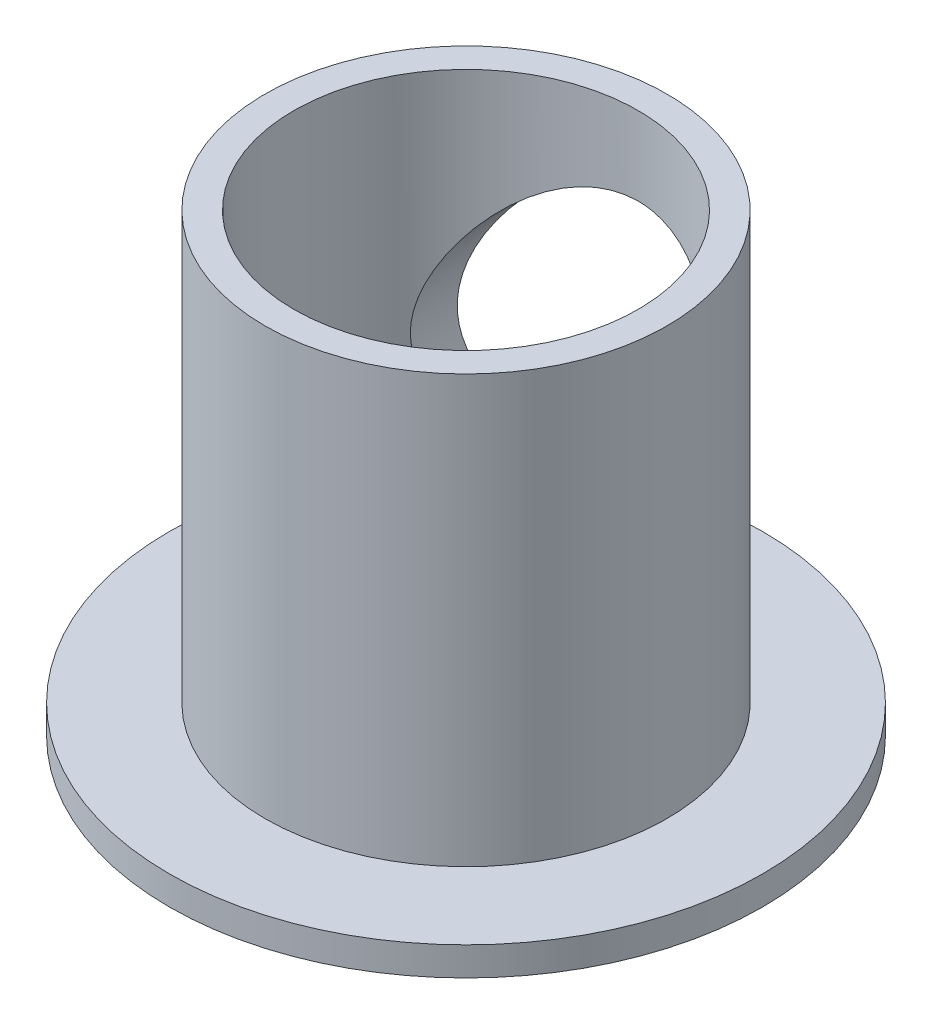
ISO-10303-21;
HEADER;
FILE_DESCRIPTION(('STEP AP214'),'2;1');
FILE_NAME('part.step','',(''),(''),'','','');
FILE_SCHEMA(('AUTOMOTIVE_DESIGN { 1 0 10303 214 1 1 1 1 }'));
ENDSEC;
DATA;
#1=APPLICATION_CONTEXT('core data for automotive mechanical design processes');
#2=APPLICATION_PROTOCOL_DEFINITION('international standard','automotive_design',2000,#1);
#3=PRODUCT_CONTEXT('',#1,'mechanical');
#4=PRODUCT('Part','Part','',(#3));
#5=PRODUCT_RELATED_PRODUCT_CATEGORY('part','',(#4));
#6=PRODUCT_DEFINITION_FORMATION('','',#4);
#7=PRODUCT_DEFINITION_CONTEXT('part definition',#1,'design');
#8=PRODUCT_DEFINITION('design','',#6,#7);
#9=PRODUCT_DEFINITION_SHAPE('','',#8);
#10=(LENGTH_UNIT() NAMED_UNIT(*) SI_UNIT(.MILLI.,.METRE.));
#11=(NAMED_UNIT(*) PLANE_ANGLE_UNIT() SI_UNIT($,.RADIAN.));
#12=(NAMED_UNIT(*) SI_UNIT($,.STERADIAN.) SOLID_ANGLE_UNIT());
#13=UNCERTAINTY_MEASURE_WITH_UNIT(LENGTH_MEASURE(1.E-05),#10,'distance_accuracy_value','');
#14=(GEOMETRIC_REPRESENTATION_CONTEXT(3) GLOBAL_UNCERTAINTY_ASSIGNED_CONTEXT((#13)) GLOBAL_UNIT_ASSIGNED_CONTEXT((#10,
#11,#12)) REPRESENTATION_CONTEXT('',''));
#15=CARTESIAN_POINT('',(0.,0.,0.));
#16=DIRECTION('',(0.,0.,1.));
#17=DIRECTION('',(1.,0.,0.));
#18=AXIS2_PLACEMENT_3D('',#15,#16,#17);
#19=CARTESIAN_POINT('',(0.,38.3,0.));
#20=DIRECTION('',(0.,-1.,0.));
#21=DIRECTION('',(0.,0.,-1.));
#22=AXIS2_PLACEMENT_3D('',#19,#20,#21);
#23=CYLINDRICAL_SURFACE('',#22,10.5);
#24=CARTESIAN_POINT('',(0.,0.,0.));
#25=DIRECTION('',(0.,1.,0.));
#26=DIRECTION('',(0.,0.,1.));
#27=AXIS2_PLACEMENT_3D('',#24,#25,#26);
#28=CIRCLE('',#27,10.5);
#29=CARTESIAN_POINT('',(0.,0.,10.5));
#30=VERTEX_POINT('',#29);
#31=EDGE_CURVE('E10',#30,#30,#28,.T.);
#32=ORIENTED_EDGE('',*,*,#31,.T.);
#33=EDGE_LOOP('',(#32));
#34=FACE_BOUND('',#33,.T.);
#35=CARTESIAN_POINT('',(0.,18.2,-10.5));
#36=CARTESIAN_POINT('',(-0.18813396926989,18.1999981399652,-10.4999982143638));
#37=CARTESIAN_POINT('',(-0.37632023168205,18.1930472478068,-10.494931071505));
#38=CARTESIAN_POINT('',(-0.751217544132532,18.1653490834224,-10.4747770476934));
#39=CARTESIAN_POINT('',(-0.93792761183307,18.1445932975088,-10.4596839836098));
#40=CARTESIAN_POINT('',(-1.30867183138487,18.0895664432479,-10.4197985544311));
#41=CARTESIAN_POINT('',(-1.49269999850735,18.0552688753554,-10.3949871725866));
#42=CARTESIAN_POINT('',(-1.85643183581326,17.9736733501462,-10.3362288065562));
#43=CARTESIAN_POINT('',(-2.03613354441446,17.9263696123128,-10.3022777604401));
#44=CARTESIAN_POINT('',(-2.38884760730317,17.8197747030476,-10.2262278665124));
#45=CARTESIAN_POINT('',(-2.56189565818614,17.7605628943339,-10.1841830361428));
#46=CARTESIAN_POINT('',(-2.90163513474682,17.6306872716277,-10.0926468767225));
#47=CARTESIAN_POINT('',(-3.06832402227701,17.5600189428385,-10.0431526125444));
#48=CARTESIAN_POINT('',(-3.55741728882151,17.3320677308045,-9.88493262830776));
#49=CARTESIAN_POINT('',(-3.86931659038185,17.1586945091357,-9.76636500186583));
#50=CARTESIAN_POINT('',(-4.48760223352023,16.7574278433571,-9.49922125826219));
#51=CARTESIAN_POINT('',(-4.79090179549309,16.5260079288354,-9.34889592100059));
#52=CARTESIAN_POINT('',(-5.35720552875823,16.0241413328602,-9.03631328380783));
#53=CARTESIAN_POINT('',(-5.62014479892603,15.7536331238741,-8.87403737413817));
#54=CARTESIAN_POINT('',(-6.00567504746141,15.2938981501326,-8.61464430894793));
#55=CARTESIAN_POINT('',(-6.14206918453724,15.1159500069083,-8.51767225553696));
#56=CARTESIAN_POINT('',(-6.39933226270985,14.7477963236592,-8.3261173931474));
#57=CARTESIAN_POINT('',(-6.52019677668207,14.5575873114575,-8.23153527162722));
#58=CARTESIAN_POINT('',(-6.74552753651135,14.1654408645094,-8.04791676019386));
#59=CARTESIAN_POINT('',(-6.8500124826915,13.963517170629,-7.95887411706089));
#60=CARTESIAN_POINT('',(-7.04170529057769,13.5482046926106,-7.78978224863079));
#61=CARTESIAN_POINT('',(-7.12892275827684,13.3348223674427,-7.70972803381294));
#62=CARTESIAN_POINT('',(-7.31125384149064,12.8225829701512,-7.53765367493881));
#63=CARTESIAN_POINT('',(-7.39905925729172,12.5192280829539,-7.45074551299657));
#64=CARTESIAN_POINT('',(-7.50265593878444,12.0526863884303,-7.34592068809347));
#65=CARTESIAN_POINT('',(-7.53249458883303,11.8953402474772,-7.31524477142138));
#66=CARTESIAN_POINT('',(-7.58237567206683,11.5775687348941,-7.26353079491979));
#67=CARTESIAN_POINT('',(-7.60242298245825,11.4171449377613,-7.24248793705429));
#68=CARTESIAN_POINT('',(-7.63244969817804,11.0930522322078,-7.21083882593878));
#69=CARTESIAN_POINT('',(-7.64234934859619,10.9293677717043,-7.20031526423087));
#70=CARTESIAN_POINT('',(-7.65158638369177,10.6013639511191,-7.19049881455281));
#71=CARTESIAN_POINT('',(-7.6509241611486,10.4370446148746,-7.19120550894715));
#72=CARTESIAN_POINT('',(-7.63904868963788,10.1091230680915,-7.20381898632499));
#73=CARTESIAN_POINT('',(-7.62782884953874,9.94552136968114,-7.21573276590194));
#74=CARTESIAN_POINT('',(-7.59507754339413,9.62049005326289,-7.25019689537212));
#75=CARTESIAN_POINT('',(-7.5735449244802,9.45906068017463,-7.27274843445925));
#76=CARTESIAN_POINT('',(-7.51758263391757,9.12137458051139,-7.33060348325488));
#77=CARTESIAN_POINT('',(-7.48196684382898,8.94551368291596,-7.36706353309181));
#78=CARTESIAN_POINT('',(-7.39916408141991,8.59893538583553,-7.4502217241013));
#79=CARTESIAN_POINT('',(-7.35196934932312,8.42822152220906,-7.49692672882889));
#80=CARTESIAN_POINT('',(-7.24665154923289,8.09244796092917,-7.5987768934508));
#81=CARTESIAN_POINT('',(-7.18850847844725,7.92739927671452,-7.65393746695728));
#82=CARTESIAN_POINT('',(-7.06202946602937,7.6037437227824,-7.77078840738445));
#83=CARTESIAN_POINT('',(-6.99369633380648,7.44513509282237,-7.8324769731747));
#84=CARTESIAN_POINT('',(-6.82249035233985,7.08170792325707,-7.98251801055776));
#85=CARTESIAN_POINT('',(-6.71576992241137,6.87949565056934,-8.07280935446103));
#86=CARTESIAN_POINT('',(-6.48592972635248,6.4871269243779,-8.25860596710564));
#87=CARTESIAN_POINT('',(-6.36280481560688,6.29697428062477,-8.35411286593137));
#88=CARTESIAN_POINT('',(-6.10070585253969,5.92885523117093,-8.54739303889987));
#89=CARTESIAN_POINT('',(-5.96171750591403,5.75090005119443,-8.64516829281177));
#90=CARTESIAN_POINT('',(-5.66845389629616,5.40781667363975,-8.84022884761121));
#91=CARTESIAN_POINT('',(-5.51418033227573,5.24268705411552,-8.93751420169143));
#92=CARTESIAN_POINT('',(-5.18859094840874,4.92384618568326,-9.13043235853823));
#93=CARTESIAN_POINT('',(-5.0170798850278,4.77031100100795,-9.2260273118198));
#94=CARTESIAN_POINT('',(-4.65911124736444,4.47805091948602,-9.41187292319723));
#95=CARTESIAN_POINT('',(-4.47265210490244,4.33932758009607,-9.50212301884105));
#96=CARTESIAN_POINT('',(-4.08576113617971,4.07826085762536,-9.67477879002408));
#97=CARTESIAN_POINT('',(-3.88535720165399,3.95588613010096,-9.75719938637782));
#98=CARTESIAN_POINT('',(-3.47117976005621,3.72877324928194,-9.91210065116896));
#99=CARTESIAN_POINT('',(-3.25741132385175,3.6240284617246,-9.98458505674654));
#100=CARTESIAN_POINT('',(-2.87421920951223,3.45823772722763,-10.1003981364266));
#101=CARTESIAN_POINT('',(-2.70746998481837,3.39287205748762,-10.1464382366331));
#102=CARTESIAN_POINT('',(-2.36809683891222,3.2735344389724,-10.2309664417583));
#103=CARTESIAN_POINT('',(-2.195474217944,3.21955998723873,-10.2694562055586));
#104=CARTESIAN_POINT('',(-1.84537583092436,3.12369474490672,-10.3381038369576));
#105=CARTESIAN_POINT('',(-1.66790265051404,3.0817976487702,-10.368266051987));
#106=CARTESIAN_POINT('',(-1.30915092884654,3.01063252845523,-10.4196427409978));
#107=CARTESIAN_POINT('',(-1.12787228769624,2.98136483623367,-10.4408569797862));
#108=CARTESIAN_POINT('',(-0.762139828546284,2.93582071263672,-10.4739190087213));
#109=CARTESIAN_POINT('',(-0.577676647248945,2.91959345093864,-10.4857313468897));
#110=CARTESIAN_POINT('',(-0.20769002934746,2.90057673380158,-10.4995777807668));
#111=CARTESIAN_POINT('',(-0.0221665945380221,2.89778725562299,-10.5016118930223));
#112=CARTESIAN_POINT('',(0.34844469032207,2.90569213984369,-10.495853254121));
#113=CARTESIAN_POINT('',(0.533532523611192,2.91638701287618,-10.4880601308207));
#114=CARTESIAN_POINT('',(0.90178425556191,2.95108641588602,-10.4628316340537));
#115=CARTESIAN_POINT('',(1.08494820583934,2.97509058785421,-10.4453965199487));
#116=CARTESIAN_POINT('',(1.43751983367347,3.03427436266542,-10.4025593627168));
#117=CARTESIAN_POINT('',(1.60711271069616,3.06873163250217,-10.3776733361537));
#118=CARTESIAN_POINT('',(1.94239027010075,3.14869370464981,-10.3201774845422));
#119=CARTESIAN_POINT('',(2.10807360229379,3.19420226406406,-10.2875650328358));
#120=CARTESIAN_POINT('',(2.43454851069882,3.29571271407372,-10.2152295168319));
#121=CARTESIAN_POINT('',(2.59534131406075,3.35171194663522,-10.1755082538158));
#122=CARTESIAN_POINT('',(2.91137940452989,3.47362424114776,-10.0896348979107));
#123=CARTESIAN_POINT('',(3.06662262763971,3.53954094508717,-10.0434804430236));
#124=CARTESIAN_POINT('',(3.54811490253685,3.7628790819522,-9.88839395063588));
#125=CARTESIAN_POINT('',(3.86317682427225,3.93753443806534,-9.76889971587814));
#126=CARTESIAN_POINT('',(4.46047109300588,4.32475214635417,-9.51106101196677));
#127=CARTESIAN_POINT('',(4.74268166454582,4.53733940785956,-9.37270417018564));
#128=CARTESIAN_POINT('',(5.16405169859677,4.90216854548694,-9.14409026903782));
#129=CARTESIAN_POINT('',(5.31459213708507,5.04363546391864,-9.05724437054079));
#130=CARTESIAN_POINT('',(5.60320787180947,5.33761260460758,-8.88158622053186));
#131=CARTESIAN_POINT('',(5.74128537018437,5.49012086729886,-8.79277431986969));
#132=CARTESIAN_POINT('',(6.00482319432873,5.80585273287608,-8.61495194250752));
#133=CARTESIAN_POINT('',(6.1302709688214,5.96908673383582,-8.52594135639713));
#134=CARTESIAN_POINT('',(6.36803803533501,6.30581995002009,-8.34984816714546));
#135=CARTESIAN_POINT('',(6.4803590747341,6.47931779432131,-8.26276530864667));
#136=CARTESIAN_POINT('',(6.67909525227569,6.81559764520371,-8.10271692362111));
#137=CARTESIAN_POINT('',(6.76700400749004,6.97727668322203,-8.02928793402629));
#138=CARTESIAN_POINT('',(6.93171296775669,7.30838892284332,-7.88753188767274));
#139=CARTESIAN_POINT('',(7.00851282920288,7.47782236408228,-7.81920498875695));
#140=CARTESIAN_POINT('',(7.15024086349212,7.82392842023445,-7.68981477016785));
#141=CARTESIAN_POINT('',(7.21518835191363,8.00058867192449,-7.62873969014919));
#142=CARTESIAN_POINT('',(7.33255075894619,8.36092140119284,-7.51600483589084));
#143=CARTESIAN_POINT('',(7.38497074585457,8.5445910079741,-7.46434125602393));
#144=CARTESIAN_POINT('',(7.46641039960603,8.87733397419177,-7.38276878590249));
#145=CARTESIAN_POINT('',(7.49804025313637,9.02520997740366,-7.3505728159243));
#146=CARTESIAN_POINT('',(7.5526516557548,9.32403138486712,-7.29444930999026));
#147=CARTESIAN_POINT('',(7.57563822637968,9.47497495303812,-7.270516973727));
#148=CARTESIAN_POINT('',(7.61258488663328,9.77898097910474,-7.23182348085043));
#149=CARTESIAN_POINT('',(7.62655420353553,9.93204110674783,-7.21705294965257));
#150=CARTESIAN_POINT('',(7.64524035544194,10.2393626686147,-7.19725559998933));
#151=CARTESIAN_POINT('',(7.64995714149531,10.3936241091898,-7.19222883307363));
#152=CARTESIAN_POINT('',(7.65004234576412,10.7024067940209,-7.19213822600669));
#153=CARTESIAN_POINT('',(7.64539536106002,10.8569280478987,-7.19709080135808));
#154=CARTESIAN_POINT('',(7.62681683942761,11.1647739122332,-7.21677524907196));
#155=CARTESIAN_POINT('',(7.61288533795025,11.3180985272569,-7.23150708409445));
#156=CARTESIAN_POINT('',(7.57598067539312,11.6226484041966,-7.27016003451669));
#157=CARTESIAN_POINT('',(7.55299728952589,11.7738710911397,-7.29409154090612));
#158=CARTESIAN_POINT('',(7.49836015789735,12.0732435788829,-7.35024657983814));
#159=CARTESIAN_POINT('',(7.46670129928126,12.2213915120295,-7.382475001454));
#160=CARTESIAN_POINT('',(7.38439181441591,12.5578854783813,-7.46492424622157));
#161=CARTESIAN_POINT('',(7.33089297054969,12.7449262282992,-7.51764135310293));
#162=CARTESIAN_POINT('',(7.2109171544905,13.1117278810864,-7.63279620767396));
#163=CARTESIAN_POINT('',(7.14443460102987,13.291485612959,-7.69523813339567));
#164=CARTESIAN_POINT('',(6.99925073657402,13.643423566118,-7.82752467088559));
#165=CARTESIAN_POINT('',(6.92053451255461,13.8155942053993,-7.89737828418907));
#166=CARTESIAN_POINT('',(6.7516174692877,14.1518842391017,-8.04226600894416));
#167=CARTESIAN_POINT('',(6.66141742016052,14.3160041723923,-8.1172997728538));
#168=CARTESIAN_POINT('',(6.46721945702913,14.6407714800592,-8.27290787282129));
#169=CARTESIAN_POINT('',(6.36289454352744,14.8011759702198,-8.35358015309865));
#170=CARTESIAN_POINT('',(6.14295713915771,15.1132255236852,-8.51662060736358));
#171=CARTESIAN_POINT('',(6.02734075522712,15.2648675369857,-8.59898935847995));
#172=CARTESIAN_POINT('',(5.78510479632348,15.5591301024567,-8.76379066353136));
#173=CARTESIAN_POINT('',(5.65848267323413,15.7017485521587,-8.84622322783898));
#174=CARTESIAN_POINT('',(5.39449123452464,15.9775599221635,-9.00963765298163));
#175=CARTESIAN_POINT('',(5.25712166806297,16.1107526223346,-9.09061947990271));
#176=CARTESIAN_POINT('',(4.94009495028054,16.3957627202032,-9.26743291044601));
#177=CARTESIAN_POINT('',(4.75782813067895,16.5451331178375,-9.36256098182103));
#178=CARTESIAN_POINT('',(4.37800632983063,16.8278668702608,-9.5460753707552));
#179=CARTESIAN_POINT('',(4.18044788415649,16.9612265801526,-9.63446015151423));
#180=CARTESIAN_POINT('',(3.77103624037095,17.2102653118354,-9.80194641625185));
#181=CARTESIAN_POINT('',(3.5591973582059,17.3259616718322,-9.88105698578036));
#182=CARTESIAN_POINT('',(3.12229577014148,17.5380366441425,-10.0276760137063));
#183=CARTESIAN_POINT('',(2.89724001201679,17.6344252905413,-10.0951904958959));
#184=CARTESIAN_POINT('',(2.50138016160148,17.7816422103477,-10.1991308760185));
#185=CARTESIAN_POINT('',(2.33336145014622,17.8376301966056,-10.2389364487615));
#186=CARTESIAN_POINT('',(1.9923137214248,17.9381503386983,-10.3107237509196));
#187=CARTESIAN_POINT('',(1.81928590192728,17.9826852084157,-10.3427073337126));
#188=CARTESIAN_POINT('',(1.46968094882015,18.0596271035141,-10.3981387729157));
#189=CARTESIAN_POINT('',(1.29311390274476,18.0920645279123,-10.421608020436));
#190=CARTESIAN_POINT('',(0.937255956587137,18.1444955277512,-10.4596144131665));
#191=CARTESIAN_POINT('',(0.757966556661614,18.1644957187998,-10.4741563069583));
#192=CARTESIAN_POINT('',(0.481932166002982,18.1854130032884,-10.4893760839373));
#193=CARTESIAN_POINT('',(0.385684076397071,18.1908798073014,-10.4933568408316));
#194=CARTESIAN_POINT('',(0.192961932438432,18.1981740809221,-10.4986694738695));
#195=CARTESIAN_POINT('',(0.0964878436385955,18.2000009539518,-10.5000009157952));
#196=CARTESIAN_POINT('',(0.,18.2,-10.5));
#197=B_SPLINE_CURVE_WITH_KNOTS('',3,(#35,#36,#37,#38,#39,#40,#41,#42,#43,#44,#45,#46,#47,#48,
#49,#50,#51,#52,#53,#54,#55,#56,#57,#58,#59,#60,#61,#62,#63,#64,#65,#66,#67,#68,#69,#70,#71,#72,
#73,#74,#75,#76,#77,#78,#79,#80,#81,#82,#83,#84,#85,#86,#87,#88,#89,#90,#91,#92,#93,#94,#95,#96,
#97,#98,#99,#100,#101,#102,#103,#104,#105,#106,#107,#108,#109,#110,#111,#112,#113,#114,#115,
#116,#117,#118,#119,#120,#121,#122,#123,#124,#125,#126,#127,#128,#129,#130,#131,#132,#133,#134,
#135,#136,#137,#138,#139,#140,#141,#142,#143,#144,#145,#146,#147,#148,#149,#150,#151,#152,#153,
#154,#155,#156,#157,#158,#159,#160,#161,#162,#163,#164,#165,#166,#167,#168,#169,#170,#171,#172,
#173,#174,#175,#176,#177,#178,#179,#180,#181,#182,#183,#184,#185,#186,#187,#188,#189,#190,#191,
#192,#193,#194,#195,#196),.UNSPECIFIED.,.T.,.F.,(4,2,2,2,2,2,2,2,2,2,2,2,2,2,2,2,2,2,2,2,2,2,2,
2,2,2,2,2,2,2,2,2,2,2,2,2,2,2,2,2,2,2,2,2,2,2,2,2,2,2,2,2,2,2,2,2,2,2,2,2,2,2,2,2,2,2,2,2,2,2,2,
2,2,2,2,2,2,2,2,2,4),(0.,0.56429778731997,1.12894390874426,1.69470049114161,2.26070892835776,
2.82306320477424,3.38563963544401,4.50930585685701,5.73526651163271,6.96317836572284,
7.69532651571444,8.42768292274419,9.15919702186227,9.89030302508527,10.8687092693252,
11.357397364889,11.845841789039,12.3380963418961,12.8303325886255,13.3228763429815,
13.8154751718003,14.3639649976298,14.9128234098296,15.4626944997145,16.0124142689562,
16.748882395205,17.4855820315411,18.2229508172451,18.9602377352009,19.7070961713952,
20.4540330621293,21.199516678576,21.944719134364,22.4989532481268,23.0530654545949,
23.6068878351783,24.16072477179,24.7166403103938,25.2725549082688,25.8284905584707,
26.3844112551872,26.9083512766069,27.4324696717313,27.956455449543,28.4806341222044,
29.6146799504435,30.7494732493912,31.4211931599454,32.0927941476677,32.7650561098037,
33.4372284809557,34.0311695768296,34.6251290398033,35.2181117219941,35.8108540913208,
36.27424030601,36.7373568871008,37.1999988107914,37.6626431820969,38.1260492007624,
38.5894534500212,39.0533826576475,39.5175858702926,40.1213488140611,40.7253718691193,
41.3301370976147,41.9348617911047,42.5573161377156,43.1799858563128,43.802800125211,
44.4256289347129,45.1869930767998,45.9485302191295,46.7093149687023,47.4697033120303,
48.0137208902745,48.5576094413662,49.1001219254471,49.6423455891204,49.931708297885,
50.2211184287605),.UNSPECIFIED.);
#198=CARTESIAN_POINT('',(0.,18.2,-10.5));
#199=VERTEX_POINT('',#198);
#200=EDGE_CURVE('E61',#199,#199,#197,.T.);
#201=ORIENTED_EDGE('',*,*,#200,.T.);
#202=EDGE_LOOP('',(#201));
#203=FACE_BOUND('',#202,.T.);
#204=CARTESIAN_POINT('',(0.,22.3,0.));
#205=DIRECTION('',(0.,1.,0.));
#206=DIRECTION('',(0.,0.,1.));
#207=AXIS2_PLACEMENT_3D('',#204,#205,#206);
#208=CIRCLE('',#207,10.5);
#209=CARTESIAN_POINT('',(0.,22.3,10.5));
#210=VERTEX_POINT('',#209);
#211=EDGE_CURVE('E62',#210,#210,#208,.T.);
#212=ORIENTED_EDGE('',*,*,#211,.F.);
#213=EDGE_LOOP('',(#212));
#214=FACE_BOUND('',#213,.T.);
#215=ADVANCED_FACE('F37',(#34,#203,#214),#23,.T.);
#216=CARTESIAN_POINT('',(0.,38.3,0.));
#217=DIRECTION('',(0.,-1.,0.));
#218=DIRECTION('',(0.,0.,-1.));
#219=AXIS2_PLACEMENT_3D('',#216,#217,#218);
#220=CYLINDRICAL_SURFACE('',#219,9.);
#221=CARTESIAN_POINT('',(0.,-1.5,0.));
#222=DIRECTION('',(0.,1.,0.));
#223=DIRECTION('',(0.,0.,1.));
#224=AXIS2_PLACEMENT_3D('',#221,#222,#223);
#225=CIRCLE('',#224,9.);
#226=CARTESIAN_POINT('',(0.,-1.5,9.));
#227=VERTEX_POINT('',#226);
#228=EDGE_CURVE('E45',#227,#227,#225,.F.);
#229=ORIENTED_EDGE('',*,*,#228,.T.);
#230=EDGE_LOOP('',(#229));
#231=FACE_BOUND('',#230,.T.);
#232=CARTESIAN_POINT('',(0.,18.2,-9.));
#233=CARTESIAN_POINT('',(-0.180599816712313,18.2000036611238,-9.00000360299185));
#234=CARTESIAN_POINT('',(-0.361163723686839,18.1935966080455,-8.99455535515891));
#235=CARTESIAN_POINT('',(-0.720805739657176,18.1680986474798,-8.97289694257527));
#236=CARTESIAN_POINT('',(-0.899883433285622,18.1490043074997,-8.95668386544575));
#237=CARTESIAN_POINT('',(-1.25515725428233,18.0984641170708,-8.91384493688113));
#238=CARTESIAN_POINT('',(-1.43135093803302,18.0670083052897,-8.88721068775473));
#239=CARTESIAN_POINT('',(-1.77948556892554,17.9922874312635,-8.82410007497103));
#240=CARTESIAN_POINT('',(-1.95142463714356,17.9490172495976,-8.78761944474358));
#241=CARTESIAN_POINT('',(-2.28871950441446,17.8517031074448,-8.70584159011783));
#242=CARTESIAN_POINT('',(-2.45411215398031,17.7977345025027,-8.66060608167815));
#243=CARTESIAN_POINT('',(-2.77876111637483,17.679575306584,-8.56196740042664));
#244=CARTESIAN_POINT('',(-2.93801470974371,17.6153802487074,-8.50856065883696));
#245=CARTESIAN_POINT('',(-3.24963848684958,17.4775804072476,-8.39448486343957));
#246=CARTESIAN_POINT('',(-3.402010163543,17.4039776779545,-8.33381739529149));
#247=CARTESIAN_POINT('',(-3.69948187286627,17.2481000543184,-8.20609828956513));
#248=CARTESIAN_POINT('',(-3.84458032673155,17.1658232890673,-8.13904527498723));
#249=CARTESIAN_POINT('',(-4.18034643938942,16.9608579005236,-7.97318774358538));
#250=CARTESIAN_POINT('',(-4.3676365263026,16.8346057551434,-7.87192380646368));
#251=CARTESIAN_POINT('',(-4.72747652955682,16.5686018967244,-7.66123165277427));
#252=CARTESIAN_POINT('',(-4.90002127700561,16.4288454861263,-7.55180059824888));
#253=CARTESIAN_POINT('',(-5.23062353783406,16.1367568066028,-7.32670859582809));
#254=CARTESIAN_POINT('',(-5.38864459855897,15.9843946252559,-7.21103307006561));
#255=CARTESIAN_POINT('',(-5.6897290134981,15.6683129946004,-6.97592002478588));
#256=CARTESIAN_POINT('',(-5.83279431275382,15.5045950267644,-6.85648299709884));
#257=CARTESIAN_POINT('',(-6.10672713420529,15.1629462564598,-6.61377460576016));
#258=CARTESIAN_POINT('',(-6.2372984879539,14.9847988461956,-6.49047407515343));
#259=CARTESIAN_POINT('',(-6.482977939577,14.6172343004138,-6.24508903042606));
#260=CARTESIAN_POINT('',(-6.59808089209403,14.4278134450171,-6.12300493337691));
#261=CARTESIAN_POINT('',(-6.81227379659363,14.0378085504978,-5.88375930007182));
#262=CARTESIAN_POINT('',(-6.91139838263264,13.8372499582075,-5.76658753565988));
#263=CARTESIAN_POINT('',(-7.09317960620709,13.4240644564738,-5.5414536468287));
#264=CARTESIAN_POINT('',(-7.17584982323132,13.2114476862131,-5.43348397053089));
#265=CARTESIAN_POINT('',(-7.32851620558681,12.7582129233783,-5.22594525967913));
#266=CARTESIAN_POINT('',(-7.39729031766375,12.5166733235668,-5.12742546295841));
#267=CARTESIAN_POINT('',(-7.48326187458956,12.1435956477424,-5.00034405280151));
#268=CARTESIAN_POINT('',(-7.50904434518002,12.0175164213465,-4.96144953428405));
#269=CARTESIAN_POINT('',(-7.55448787090564,11.7620352555881,-4.89197612325607));
#270=CARTESIAN_POINT('',(-7.57415219538839,11.6326351309683,-4.8613927906151));
#271=CARTESIAN_POINT('',(-7.60719367206635,11.3691380489698,-4.80952951076495));
#272=CARTESIAN_POINT('',(-7.62047328092826,11.2349998989127,-4.78839422892247));
#273=CARTESIAN_POINT('',(-7.63993902562466,10.9649165686709,-4.75727579819358));
#274=CARTESIAN_POINT('',(-7.64612589228482,10.828971576121,-4.74729150032898));
#275=CARTESIAN_POINT('',(-7.65120778007609,10.5566549875266,-4.73909782914274));
#276=CARTESIAN_POINT('',(-7.65010687238061,10.4202836721927,-4.74088188165906));
#277=CARTESIAN_POINT('',(-7.64066762456329,10.1484769431941,-4.7560763341783));
#278=CARTESIAN_POINT('',(-7.63232929060261,10.0130415287329,-4.76948672428381));
#279=CARTESIAN_POINT('',(-7.60028196566713,9.64942073642459,-4.82050077090965));
#280=CARTESIAN_POINT('',(-7.56987844927957,9.42323152739679,-4.86849914279792));
#281=CARTESIAN_POINT('',(-7.49075248395732,8.98095751581095,-4.98936043622822));
#282=CARTESIAN_POINT('',(-7.44200115844835,8.76488924795622,-5.06226253554444));
#283=CARTESIAN_POINT('',(-7.33297222406577,8.36138670254785,-5.21879901344488));
#284=CARTESIAN_POINT('',(-7.27396913962325,8.17305782743959,-5.30106133211077));
#285=CARTESIAN_POINT('',(-7.14343162825316,7.8055600197452,-5.47569862410736));
#286=CARTESIAN_POINT('',(-7.07188752848383,7.62639829656272,-5.56808138251929));
#287=CARTESIAN_POINT('',(-6.91686361466089,7.27643770227781,-5.759532735188));
#288=CARTESIAN_POINT('',(-6.83335487155996,7.10566048812345,-5.85861721761623));
#289=CARTESIAN_POINT('',(-6.65498480105072,6.77251890453674,-6.06047221439951));
#290=CARTESIAN_POINT('',(-6.56012625202836,6.61015249006398,-6.16324182235462));
#291=CARTESIAN_POINT('',(-6.3517346895948,6.28167820828871,-6.378048522995));
#292=CARTESIAN_POINT('',(-6.23733594883805,6.11619716584202,-6.49020434643994));
#293=CARTESIAN_POINT('',(-5.99570244009948,5.79452801100948,-6.71406662101314));
#294=CARTESIAN_POINT('',(-5.86846624921597,5.63834093182249,-6.82577302089727));
#295=CARTESIAN_POINT('',(-5.60132699730449,5.33575945513435,-7.04663999656296));
#296=CARTESIAN_POINT('',(-5.46144179020651,5.18935174674998,-7.15580389540907));
#297=CARTESIAN_POINT('',(-5.168763788678,4.90661584006878,-7.36999141346288));
#298=CARTESIAN_POINT('',(-5.01596748601321,4.77029040034261,-7.47501389591145));
#299=CARTESIAN_POINT('',(-4.71103458697867,4.51972496309908,-7.67047016300387));
#300=CARTESIAN_POINT('',(-4.55994134380825,4.40459246363914,-7.76138578041883));
#301=CARTESIAN_POINT('',(-4.24712732175004,4.18439073019375,-7.93687977738459));
#302=CARTESIAN_POINT('',(-4.08540848746372,4.07931966345587,-8.02145931047912));
#303=CARTESIAN_POINT('',(-3.75170514935602,3.88029792669619,-8.18285029738847));
#304=CARTESIAN_POINT('',(-3.57972673773554,3.7863407541311,-8.25966628964525));
#305=CARTESIAN_POINT('',(-3.22595659941241,3.6106422670314,-8.40414702910606));
#306=CARTESIAN_POINT('',(-3.04416670497776,3.5288986823132,-8.4718134767462));
#307=CARTESIAN_POINT('',(-2.7027014054321,3.39137544110981,-8.58616344031408));
#308=CARTESIAN_POINT('',(-2.54439383745816,3.33353924813563,-8.6344643293896));
#309=CARTESIAN_POINT('',(-2.222257213273,3.22792445121562,-8.72292711534354));
#310=CARTESIAN_POINT('',(-2.05842923583336,3.18014389531777,-8.7630905917609));
#311=CARTESIAN_POINT('',(-1.72619351385821,3.09532809665001,-8.8345408017867));
#312=CARTESIAN_POINT('',(-1.55778796736882,3.05828779296803,-8.86583171607918));
#313=CARTESIAN_POINT('',(-1.2174000709161,2.9955056634497,-8.91894636384492));
#314=CARTESIAN_POINT('',(-1.04541768331284,2.96976395657416,-8.94076999763895));
#315=CARTESIAN_POINT('',(-0.698432239942122,2.92994039120734,-8.97455829716669));
#316=CARTESIAN_POINT('',(-0.523419811832908,2.91590588335415,-8.98648292470033));
#317=CARTESIAN_POINT('',(-0.172443115815647,2.89992666186027,-9.00006134555704));
#318=CARTESIAN_POINT('',(0.00352115331245654,2.8979819637198,-9.00171512571195));
#319=CARTESIAN_POINT('',(0.354959404086938,2.90621823074758,-8.99471484501872));
#320=CARTESIAN_POINT('',(0.530433380384725,2.91639932768215,-8.98606067215805));
#321=CARTESIAN_POINT('',(0.879472759681113,2.94870110992323,-8.95863672501922));
#322=CARTESIAN_POINT('',(1.05303820874143,2.97082150643024,-8.93986719542125));
#323=CARTESIAN_POINT('',(1.38616361599847,3.02486081587621,-8.89410071688913));
#324=CARTESIAN_POINT('',(1.54591967021725,3.05607886689838,-8.86769302278233));
#325=CARTESIAN_POINT('',(1.86171371242474,3.12822353847765,-8.80680936722267));
#326=CARTESIAN_POINT('',(2.01775027031171,3.16915382907088,-8.77233035586764));
#327=CARTESIAN_POINT('',(2.32521938534658,3.26017425130109,-8.69588691350605));
#328=CARTESIAN_POINT('',(2.47665243479147,3.31026339944695,-8.65392328622004));
#329=CARTESIAN_POINT('',(2.77430435248879,3.41902148883053,-8.56314536157));
#330=CARTESIAN_POINT('',(2.92052222306265,3.47769206088482,-8.51432976212625));
#331=CARTESIAN_POINT('',(3.25519123864129,3.62397609933643,-8.39315833173497));
#332=CARTESIAN_POINT('',(3.44141493107024,3.71470738729827,-8.31838932024314));
#333=CARTESIAN_POINT('',(3.80285398500914,3.90899609296338,-8.15949185081781));
#334=CARTESIAN_POINT('',(3.97806628203297,4.01255705756583,-8.0753608053085));
#335=CARTESIAN_POINT('',(4.31729694513159,4.23143465579033,-7.89921114632948));
#336=CARTESIAN_POINT('',(4.48129437375064,4.34677232643003,-7.80717846633221));
#337=CARTESIAN_POINT('',(4.79754628541746,4.58798554577968,-7.61692980701432));
#338=CARTESIAN_POINT('',(4.94979815558324,4.71386342631997,-7.51871246064656));
#339=CARTESIAN_POINT('',(5.27897284724892,5.00788351386106,-7.29257364218721));
#340=CARTESIAN_POINT('',(5.45258408574692,5.17873903636836,-7.16335100834447));
#341=CARTESIAN_POINT('',(5.78143585698064,5.534404078531,-6.90067387553667));
#342=CARTESIAN_POINT('',(5.93666903815216,5.71921913416174,-6.76721770996518));
#343=CARTESIAN_POINT('',(6.22874758935057,6.10216899350467,-6.49938088505661));
#344=CARTESIAN_POINT('',(6.36559470667993,6.30030252881877,-6.36500031484718));
#345=CARTESIAN_POINT('',(6.62075049967444,6.70989906998693,-6.0991417837548));
#346=CARTESIAN_POINT('',(6.73906879514866,6.92135507856282,-5.96766234732502));
#347=CARTESIAN_POINT('',(6.91414503495399,7.27293112659535,-5.7623842145206));
#348=CARTESIAN_POINT('',(6.97689595495407,7.40865085667984,-5.68611629095383));
#349=CARTESIAN_POINT('',(7.09507046712222,7.68553853912022,-5.53795431784834));
#350=CARTESIAN_POINT('',(7.15049593825486,7.82670508232947,-5.46605914926975));
#351=CARTESIAN_POINT('',(7.25357252870508,8.11453423959525,-5.32851409881753));
#352=CARTESIAN_POINT('',(7.30123649842355,8.26118726436334,-5.26285397056653));
#353=CARTESIAN_POINT('',(7.38834433358377,8.56023645885712,-5.13984832210278));
#354=CARTESIAN_POINT('',(7.42779074742656,8.71263083073163,-5.08250022587394));
#355=CARTESIAN_POINT('',(7.51485870729068,9.09903952431883,-4.95334529071284));
#356=CARTESIAN_POINT('',(7.55710527678835,9.33665777497977,-4.8880993288462));
#357=CARTESIAN_POINT('',(7.60360446577451,9.69991973386466,-4.81518581055608));
#358=CARTESIAN_POINT('',(7.61629003986731,9.82207620436392,-4.79504482612611));
#359=CARTESIAN_POINT('',(7.63579412135983,10.0679945548722,-4.763926288278));
#360=CARTESIAN_POINT('',(7.64261545901561,10.1917556311407,-4.75294431452369));
#361=CARTESIAN_POINT('',(7.65023891553312,10.4406915024373,-4.7406643299908));
#362=CARTESIAN_POINT('',(7.65100462866877,10.5658703238477,-4.7394248904905));
#363=CARTESIAN_POINT('',(7.64640210102135,10.8158162865171,-4.74684663094413));
#364=CARTESIAN_POINT('',(7.64103387528994,10.9405834287856,-4.75550778660361));
#365=CARTESIAN_POINT('',(7.62429623745144,11.1888322218631,-4.78229576242353));
#366=CARTESIAN_POINT('',(7.61291939566343,11.3123120877625,-4.80043430111349));
#367=CARTESIAN_POINT('',(7.58442590178306,11.5570651828786,-4.84532621457056));
#368=CARTESIAN_POINT('',(7.56730599594275,11.678337120033,-4.87208447251993));
#369=CARTESIAN_POINT('',(7.52113364809629,11.9575228408573,-4.94316543416573));
#370=CARTESIAN_POINT('',(7.490008394655,12.1143598275144,-4.99037049421648));
#371=CARTESIAN_POINT('',(7.41899707731149,12.4224345914265,-5.09533998284398));
#372=CARTESIAN_POINT('',(7.37910556127903,12.5736688153646,-5.15311097908114));
#373=CARTESIAN_POINT('',(7.29111872382239,12.8708127023086,-5.27687077784935));
#374=CARTESIAN_POINT('',(7.24299871951544,13.0167046931436,-5.34288413925521));
#375=CARTESIAN_POINT('',(7.13917312426291,13.3027907863114,-5.48084595088265));
#376=CARTESIAN_POINT('',(7.08346877779643,13.4429858185413,-5.5527934266413));
#377=CARTESIAN_POINT('',(6.92876654223955,13.8015713407277,-5.74590278163212));
#378=CARTESIAN_POINT('',(6.82403109140339,14.0157059681446,-5.87040155630666));
#379=CARTESIAN_POINT('',(6.59670316709471,14.430986618492,-6.12475963660223));
#380=CARTESIAN_POINT('',(6.47410051903202,14.6321251458776,-6.25462196613636));
#381=CARTESIAN_POINT('',(6.21138270623976,15.0217345293344,-6.51559789650995));
#382=CARTESIAN_POINT('',(6.07126846394726,15.2102060518467,-6.64671143110543));
#383=CARTESIAN_POINT('',(5.77359679508388,15.5742746782857,-6.90685514743795));
#384=CARTESIAN_POINT('',(5.61604542970237,15.7498762207909,-7.03588603534946));
#385=CARTESIAN_POINT('',(5.30724114807371,16.0633384115831,-7.27085021156942));
#386=CARTESIAN_POINT('',(5.15831924684661,16.2030019276521,-7.37744436419342));
#387=CARTESIAN_POINT('',(4.8475685475131,16.4716345438018,-7.58524955925996));
#388=CARTESIAN_POINT('',(4.68573937593608,16.6006033342113,-7.68646044579688));
#389=CARTESIAN_POINT('',(4.34953077174167,16.8466187603914,-7.88158032451708));
#390=CARTESIAN_POINT('',(4.17516958101332,16.9636821492323,-7.9754995320914));
#391=CARTESIAN_POINT('',(3.81403375463079,17.1847901780655,-8.15436810763525));
#392=CARTESIAN_POINT('',(3.62726240496932,17.2888382434202,-8.23931983473629));
#393=CARTESIAN_POINT('',(3.28179872272346,17.4624202153165,-8.38195342665508));
#394=CARTESIAN_POINT('',(3.12528161570297,17.5346428647857,-8.44164251896536));
#395=CARTESIAN_POINT('',(2.80538194871703,17.6691590939177,-8.55327524166938));
#396=CARTESIAN_POINT('',(2.64200084217707,17.7314547623236,-8.60522050129974));
#397=CARTESIAN_POINT('',(2.30929833785606,17.8452381097676,-8.70040391714047));
#398=CARTESIAN_POINT('',(2.13998533562576,17.8967403967164,-8.74365383847276));
#399=CARTESIAN_POINT('',(1.79623228932581,17.9882584468726,-8.82069046480542));
#400=CARTESIAN_POINT('',(1.62179364932245,18.0282773239833,-8.85447973514665));
#401=CARTESIAN_POINT('',(1.20937472254581,18.1076170338971,-8.9215737211155));
#402=CARTESIAN_POINT('',(0.969789000468794,18.1421591162038,-8.9508789001242));
#403=CARTESIAN_POINT('',(0.486780838013472,18.1883498805772,-8.99009109318037));
#404=CARTESIAN_POINT('',(0.243357817458025,18.1999950666445,-8.99999514497717));
#405=CARTESIAN_POINT('',(0.,18.2,-9.));
#406=B_SPLINE_CURVE_WITH_KNOTS('',3,(#232,#233,#234,#235,#236,#237,#238,#239,#240,#241,#242,
#243,#244,#245,#246,#247,#248,#249,#250,#251,#252,#253,#254,#255,#256,#257,#258,#259,#260,#261,
#262,#263,#264,#265,#266,#267,#268,#269,#270,#271,#272,#273,#274,#275,#276,#277,#278,#279,#280,
#281,#282,#283,#284,#285,#286,#287,#288,#289,#290,#291,#292,#293,#294,#295,#296,#297,#298,#299,
#300,#301,#302,#303,#304,#305,#306,#307,#308,#309,#310,#311,#312,#313,#314,#315,#316,#317,#318,
#319,#320,#321,#322,#323,#324,#325,#326,#327,#328,#329,#330,#331,#332,#333,#334,#335,#336,#337,
#338,#339,#340,#341,#342,#343,#344,#345,#346,#347,#348,#349,#350,#351,#352,#353,#354,#355,#356,
#357,#358,#359,#360,#361,#362,#363,#364,#365,#366,#367,#368,#369,#370,#371,#372,#373,#374,#375,
#376,#377,#378,#379,#380,#381,#382,#383,#384,#385,#386,#387,#388,#389,#390,#391,#392,#393,#394,
#395,#396,#397,#398,#399,#400,#401,#402,#403,#404,#405),.UNSPECIFIED.,.T.,.F.,(4,2,2,2,2,2,2,2,
2,2,2,2,2,2,2,2,2,2,2,2,2,2,2,2,2,2,2,2,2,2,2,2,2,2,2,2,2,2,2,2,2,2,2,2,2,2,2,2,2,2,2,2,2,2,2,2,
2,2,2,2,2,2,2,2,2,2,2,2,2,2,2,2,2,2,2,2,2,2,2,2,2,2,2,2,2,2,4),(0.,0.541543804646441,
1.08323418139929,1.6253619704128,2.16772504891383,2.70639561768003,3.245302125416,
3.78409115615854,4.32299663732149,5.06451492227493,5.8062920848994,6.5498828873944,
7.29337686305677,8.05153225981426,8.80993922591136,9.56667952811198,10.3227926930252,
11.1296222544926,11.532579245659,11.9353205378,12.3440333000575,12.7527039453692,
13.1611463140458,13.5695883350195,14.2662732444392,14.9640592432841,15.6045708512065,
16.2455786749039,16.8881633859516,17.5305911154949,18.2210173444313,18.9115201843882,
19.601063164547,20.2907941152462,20.9220213544916,21.5531333921751,22.1838743315197,
22.8144978865335,23.3399541908207,23.8653084017795,24.390414656891,24.9155264406147,
25.4427519194763,25.9699780742883,26.4972099583147,27.0244290897104,27.5186111561166,
28.0129802609915,28.5072963109528,29.0017064232463,29.6614444824246,30.3213653418709,
30.9824863720031,31.6437540515805,32.4698696057714,33.2963145128756,34.1226808239182,
34.9486166687801,35.4519187196679,35.9550914228977,36.4574223816967,36.9595973266253,
37.7063447413746,38.0793031686987,38.4520814939064,38.8270992291014,39.2021160440666,
39.5775976584245,39.9532923631601,40.4526373482331,40.9522937816732,41.4534761988724,
41.9545764782863,42.7602025517242,43.5662891998695,44.3723334046449,45.1780983011524,
45.8684327040252,46.5587870889076,47.2481561720686,47.9373434442034,48.4840845023186,
49.0307103679246,49.576591575444,50.1223246186808,50.8519421967856,51.5816711674778),.UNSPECIFIED.);
#407=CARTESIAN_POINT('',(0.,18.2,-9.));
#408=VERTEX_POINT('',#407);
#409=EDGE_CURVE('E55',#408,#408,#406,.T.);
#410=ORIENTED_EDGE('',*,*,#409,.F.);
#411=EDGE_LOOP('',(#410));
#412=FACE_BOUND('',#411,.T.);
#413=CARTESIAN_POINT('',(0.,22.3,0.));
#414=DIRECTION('',(0.,1.,0.));
#415=DIRECTION('',(0.,0.,1.));
#416=AXIS2_PLACEMENT_3D('',#413,#414,#415);
#417=CIRCLE('',#416,9.);
#418=CARTESIAN_POINT('',(0.,22.3,9.));
#419=VERTEX_POINT('',#418);
#420=EDGE_CURVE('E41',#419,#419,#417,.T.);
#421=ORIENTED_EDGE('',*,*,#420,.T.);
#422=EDGE_LOOP('',(#421));
#423=FACE_BOUND('',#422,.T.);
#424=ADVANCED_FACE('F63',(#231,#412,#423),#220,.F.);
#425=CARTESIAN_POINT('',(0.,-1.5,0.));
#426=DIRECTION('',(0.,1.,0.));
#427=DIRECTION('',(0.,0.,1.));
#428=AXIS2_PLACEMENT_3D('',#425,#426,#427);
#429=CYLINDRICAL_SURFACE('',#428,15.5);
#430=CARTESIAN_POINT('',(0.,-1.5,0.));
#431=DIRECTION('',(0.,1.,0.));
#432=DIRECTION('',(0.,0.,1.));
#433=AXIS2_PLACEMENT_3D('',#430,#431,#432);
#434=CIRCLE('',#433,15.5);
#435=CARTESIAN_POINT('',(0.,-1.5,15.5));
#436=VERTEX_POINT('',#435);
#437=EDGE_CURVE('E50',#436,#436,#434,.T.);
#438=ORIENTED_EDGE('',*,*,#437,.T.);
#439=EDGE_LOOP('',(#438));
#440=FACE_BOUND('',#439,.T.);
#441=CARTESIAN_POINT('',(0.,0.,0.));
#442=DIRECTION('',(0.,1.,0.));
#443=DIRECTION('',(0.,0.,1.));
#444=AXIS2_PLACEMENT_3D('',#441,#442,#443);
#445=CIRCLE('',#444,15.5);
#446=CARTESIAN_POINT('',(0.,0.,15.5));
#447=VERTEX_POINT('',#446);
#448=EDGE_CURVE('E53',#447,#447,#445,.T.);
#449=ORIENTED_EDGE('',*,*,#448,.F.);
#450=EDGE_LOOP('',(#449));
#451=FACE_BOUND('',#450,.T.);
#452=ADVANCED_FACE('F96',(#440,#451),#429,.T.);
#453=CARTESIAN_POINT('',(0.,-1.5,-12.5));
#454=DIRECTION('',(0.,1.,0.));
#455=DIRECTION('',(0.,0.,1.));
#456=AXIS2_PLACEMENT_3D('',#453,#454,#455);
#457=CYLINDRICAL_SURFACE('',#456,1.);
#458=CARTESIAN_POINT('',(0.,-1.5,-12.5));
#459=DIRECTION('',(0.,1.,0.));
#460=DIRECTION('',(0.,0.,1.));
#461=AXIS2_PLACEMENT_3D('',#458,#459,#460);
#462=CIRCLE('',#461,1.);
#463=CARTESIAN_POINT('',(0.,-1.5,-11.5));
#464=VERTEX_POINT('',#463);
#465=EDGE_CURVE('E85',#464,#464,#462,.T.);
#466=ORIENTED_EDGE('',*,*,#465,.F.);
#467=EDGE_LOOP('',(#466));
#468=FACE_BOUND('',#467,.T.);
#469=CARTESIAN_POINT('',(0.,0.,-12.5));
#470=DIRECTION('',(0.,1.,0.));
#471=DIRECTION('',(0.,0.,1.));
#472=AXIS2_PLACEMENT_3D('',#469,#470,#471);
#473=CIRCLE('',#472,1.);
#474=CARTESIAN_POINT('',(0.,0.,-11.5));
#475=VERTEX_POINT('',#474);
#476=EDGE_CURVE('E84',#475,#475,#473,.T.);
#477=ORIENTED_EDGE('',*,*,#476,.T.);
#478=EDGE_LOOP('',(#477));
#479=FACE_BOUND('',#478,.T.);
#480=ADVANCED_FACE('F98',(#468,#479),#457,.F.);
#481=CARTESIAN_POINT('',(0.,-1.5,0.));
#482=DIRECTION('',(0.,-1.,0.));
#483=DIRECTION('',(0.,0.,1.));
#484=AXIS2_PLACEMENT_3D('',#481,#482,#483);
#485=PLANE('',#484);
#486=ORIENTED_EDGE('',*,*,#465,.T.);
#487=EDGE_LOOP('',(#486));
#488=FACE_BOUND('',#487,.T.);
#489=ORIENTED_EDGE('',*,*,#437,.F.);
#490=EDGE_LOOP('',(#489));
#491=FACE_BOUND('',#490,.T.);
#492=ORIENTED_EDGE('',*,*,#228,.F.);
#493=EDGE_LOOP('',(#492));
#494=FACE_BOUND('',#493,.T.);
#495=ADVANCED_FACE('F74',(#488,#491,#494),#485,.T.);
#496=CARTESIAN_POINT('',(0.,0.,0.));
#497=DIRECTION('',(0.,-1.,0.));
#498=DIRECTION('',(0.,0.,1.));
#499=AXIS2_PLACEMENT_3D('',#496,#497,#498);
#500=PLANE('',#499);
#501=ORIENTED_EDGE('',*,*,#31,.F.);
#502=EDGE_LOOP('',(#501));
#503=FACE_BOUND('',#502,.T.);
#504=ORIENTED_EDGE('',*,*,#476,.F.);
#505=EDGE_LOOP('',(#504));
#506=FACE_BOUND('',#505,.T.);
#507=ORIENTED_EDGE('',*,*,#448,.T.);
#508=EDGE_LOOP('',(#507));
#509=FACE_BOUND('',#508,.T.);
#510=ADVANCED_FACE('F72',(#503,#506,#509),#500,.F.);
#511=CARTESIAN_POINT('',(0.,10.55,-15.5));
#512=DIRECTION('',(0.,0.,1.));
#513=DIRECTION('',(1.,0.,0.));
#514=AXIS2_PLACEMENT_3D('',#511,#512,#513);
#515=CYLINDRICAL_SURFACE('',#514,7.65);
#516=ORIENTED_EDGE('',*,*,#409,.T.);
#517=EDGE_LOOP('',(#516));
#518=FACE_BOUND('',#517,.T.);
#519=ORIENTED_EDGE('',*,*,#200,.F.);
#520=EDGE_LOOP('',(#519));
#521=FACE_BOUND('',#520,.T.);
#522=ADVANCED_FACE('F66',(#518,#521),#515,.F.);
#523=CARTESIAN_POINT('',(0.,22.3,0.));
#524=DIRECTION('',(0.,1.,0.));
#525=DIRECTION('',(0.,0.,1.));
#526=AXIS2_PLACEMENT_3D('',#523,#524,#525);
#527=PLANE('',#526);
#528=ORIENTED_EDGE('',*,*,#420,.F.);
#529=EDGE_LOOP('',(#528));
#530=FACE_BOUND('',#529,.T.);
#531=ORIENTED_EDGE('',*,*,#211,.T.);
#532=EDGE_LOOP('',(#531));
#533=FACE_BOUND('',#532,.T.);
#534=ADVANCED_FACE('F71',(#530,#533),#527,.T.);
#535=CLOSED_SHELL('',(#215,#424,#452,#480,#495,#510,#522,#534));
#536=MANIFOLD_SOLID_BREP('B2',#535);
#537=ADVANCED_BREP_SHAPE_REPRESENTATION('',(#18,#536),#14);
#538=SHAPE_DEFINITION_REPRESENTATION(#9,#537);
ENDSEC;
END-ISO-10303-21;
